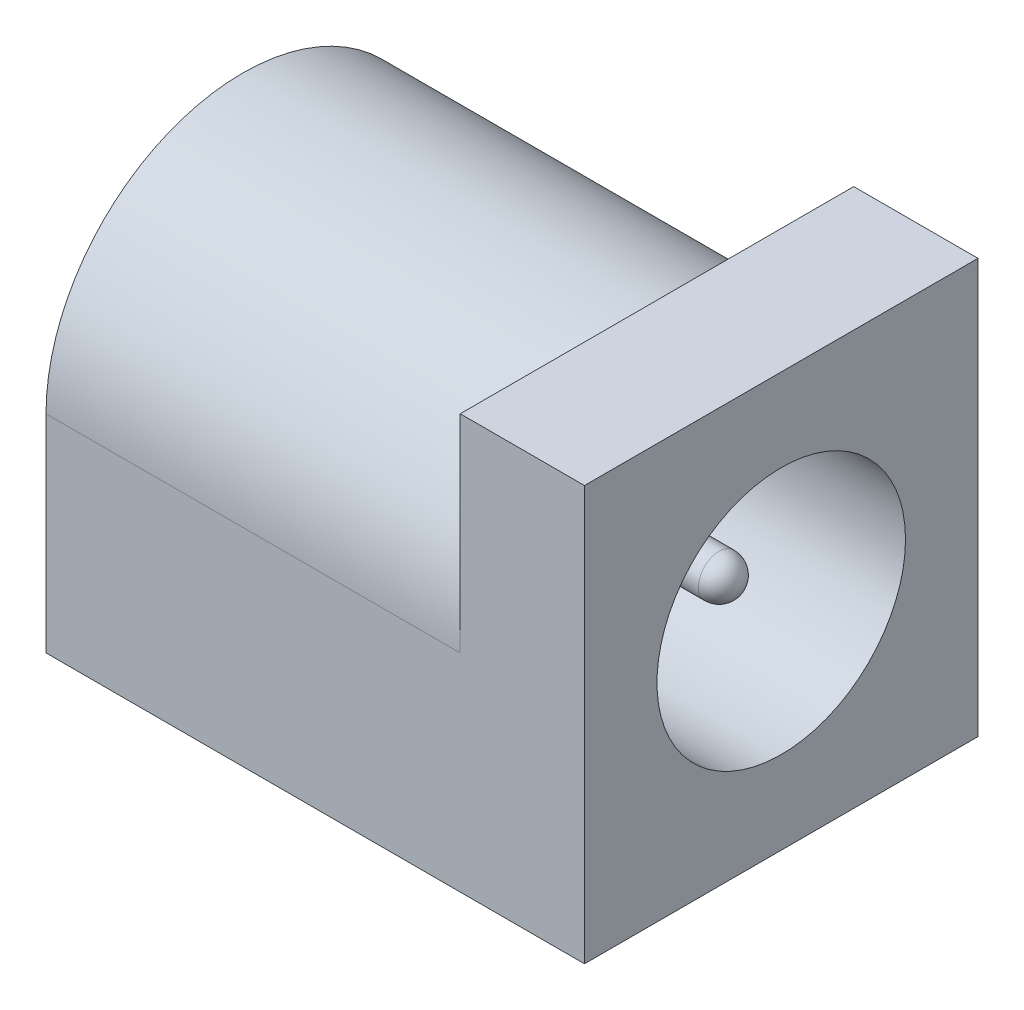
ISO-10303-21;
HEADER;
FILE_DESCRIPTION(('STEP AP214'),'2;1');
FILE_NAME('part.step','',(''),(''),'','','');
FILE_SCHEMA(('AUTOMOTIVE_DESIGN { 1 0 10303 214 1 1 1 1 }'));
ENDSEC;
DATA;
#1=APPLICATION_CONTEXT('core data for automotive mechanical design processes');
#2=APPLICATION_PROTOCOL_DEFINITION('international standard','automotive_design',2000,#1);
#3=PRODUCT_CONTEXT('',#1,'mechanical');
#4=PRODUCT('Part','Part','',(#3));
#5=PRODUCT_RELATED_PRODUCT_CATEGORY('part','',(#4));
#6=PRODUCT_DEFINITION_FORMATION('','',#4);
#7=PRODUCT_DEFINITION_CONTEXT('part definition',#1,'design');
#8=PRODUCT_DEFINITION('design','',#6,#7);
#9=PRODUCT_DEFINITION_SHAPE('','',#8);
#10=(LENGTH_UNIT() NAMED_UNIT(*) SI_UNIT(.MILLI.,.METRE.));
#11=(NAMED_UNIT(*) PLANE_ANGLE_UNIT() SI_UNIT($,.RADIAN.));
#12=(NAMED_UNIT(*) SI_UNIT($,.STERADIAN.) SOLID_ANGLE_UNIT());
#13=UNCERTAINTY_MEASURE_WITH_UNIT(LENGTH_MEASURE(1.E-05),#10,'distance_accuracy_value','');
#14=(GEOMETRIC_REPRESENTATION_CONTEXT(3) GLOBAL_UNCERTAINTY_ASSIGNED_CONTEXT((#13)) GLOBAL_UNIT_ASSIGNED_CONTEXT((#10,
#11,#12)) REPRESENTATION_CONTEXT('',''));
#15=CARTESIAN_POINT('',(0.,0.,0.));
#16=DIRECTION('',(0.,0.,1.));
#17=DIRECTION('',(1.,0.,0.));
#18=AXIS2_PLACEMENT_3D('',#15,#16,#17);
#19=CARTESIAN_POINT('',(10.,2.5,0.));
#20=DIRECTION('',(-1.,0.,0.));
#21=DIRECTION('',(0.,0.,1.));
#22=AXIS2_PLACEMENT_3D('',#19,#20,#21);
#23=CYLINDRICAL_SURFACE('',#22,4.75);
#24=CARTESIAN_POINT('',(0.,2.5,0.));
#25=DIRECTION('',(1.,0.,0.));
#26=DIRECTION('',(0.,0.,1.));
#27=AXIS2_PLACEMENT_3D('',#24,#25,#26);
#28=CIRCLE('',#27,4.75);
#29=CARTESIAN_POINT('',(0.,2.5,-4.75));
#30=VERTEX_POINT('',#29);
#31=CARTESIAN_POINT('',(0.,2.5,4.75));
#32=VERTEX_POINT('',#31);
#33=EDGE_CURVE('E93',#30,#32,#28,.T.);
#34=ORIENTED_EDGE('',*,*,#33,.T.);
#35=DIRECTION('',(-1.,0.,0.));
#36=VECTOR('',#35,1.);
#37=CARTESIAN_POINT('',(10.,2.5,4.75));
#38=LINE('',#37,#36);
#39=CARTESIAN_POINT('',(10.,2.5,4.75));
#40=VERTEX_POINT('',#39);
#41=EDGE_CURVE('E46',#40,#32,#38,.T.);
#42=ORIENTED_EDGE('',*,*,#41,.F.);
#43=CARTESIAN_POINT('',(10.,2.5,0.));
#44=DIRECTION('',(1.,0.,0.));
#45=DIRECTION('',(0.,0.,1.));
#46=AXIS2_PLACEMENT_3D('',#43,#44,#45);
#47=CIRCLE('',#46,4.75);
#48=CARTESIAN_POINT('',(10.,2.5,-4.75));
#49=VERTEX_POINT('',#48);
#50=EDGE_CURVE('E94',#49,#40,#47,.T.);
#51=ORIENTED_EDGE('',*,*,#50,.F.);
#52=DIRECTION('',(-1.,0.,0.));
#53=VECTOR('',#52,1.);
#54=CARTESIAN_POINT('',(10.,2.5,-4.75));
#55=LINE('',#54,#53);
#56=EDGE_CURVE('E53',#49,#30,#55,.T.);
#57=ORIENTED_EDGE('',*,*,#56,.T.);
#58=EDGE_LOOP('',(#34,#42,#51,#57));
#59=FACE_BOUND('',#58,.T.);
#60=ADVANCED_FACE('F37',(#59),#23,.T.);
#61=CARTESIAN_POINT('',(10.,-2.5,4.75));
#62=DIRECTION('',(0.,0.,-1.));
#63=DIRECTION('',(-1.,0.,0.));
#64=AXIS2_PLACEMENT_3D('',#61,#62,#63);
#65=PLANE('',#64);
#66=DIRECTION('',(0.,-1.,0.));
#67=VECTOR('',#66,1.);
#68=CARTESIAN_POINT('',(0.,-2.5,4.75));
#69=LINE('',#68,#67);
#70=CARTESIAN_POINT('',(0.,-2.5,4.75));
#71=VERTEX_POINT('',#70);
#72=EDGE_CURVE('E82',#32,#71,#69,.T.);
#73=ORIENTED_EDGE('',*,*,#72,.T.);
#74=DIRECTION('',(-1.,0.,0.));
#75=VECTOR('',#74,1.);
#76=CARTESIAN_POINT('',(10.,-2.5,4.75));
#77=LINE('',#76,#75);
#78=CARTESIAN_POINT('',(13.,-2.5,4.75));
#79=VERTEX_POINT('',#78);
#80=EDGE_CURVE('E78',#79,#71,#77,.T.);
#81=ORIENTED_EDGE('',*,*,#80,.F.);
#82=DIRECTION('',(0.,-1.,0.));
#83=VECTOR('',#82,1.);
#84=CARTESIAN_POINT('',(13.,7.5,4.75));
#85=LINE('',#84,#83);
#86=CARTESIAN_POINT('',(13.,7.5,4.75));
#87=VERTEX_POINT('',#86);
#88=EDGE_CURVE('E121',#87,#79,#85,.T.);
#89=ORIENTED_EDGE('',*,*,#88,.F.);
#90=DIRECTION('',(-1.,0.,0.));
#91=VECTOR('',#90,1.);
#92=CARTESIAN_POINT('',(13.,7.5,4.75));
#93=LINE('',#92,#91);
#94=CARTESIAN_POINT('',(10.,7.5,4.75));
#95=VERTEX_POINT('',#94);
#96=EDGE_CURVE('E113',#87,#95,#93,.T.);
#97=ORIENTED_EDGE('',*,*,#96,.T.);
#98=DIRECTION('',(0.,-1.,0.));
#99=VECTOR('',#98,1.);
#100=CARTESIAN_POINT('',(10.,7.5,4.75));
#101=LINE('',#100,#99);
#102=EDGE_CURVE('E108',#95,#40,#101,.T.);
#103=ORIENTED_EDGE('',*,*,#102,.T.);
#104=ORIENTED_EDGE('',*,*,#41,.T.);
#105=EDGE_LOOP('',(#73,#81,#89,#97,#103,#104));
#106=FACE_BOUND('',#105,.T.);
#107=ADVANCED_FACE('F105',(#106),#65,.F.);
#108=CARTESIAN_POINT('',(10.,-2.5,4.75));
#109=DIRECTION('',(0.,1.,0.));
#110=DIRECTION('',(0.,0.,1.));
#111=AXIS2_PLACEMENT_3D('',#108,#109,#110);
#112=PLANE('',#111);
#113=DIRECTION('',(0.,0.,-1.));
#114=VECTOR('',#113,1.);
#115=CARTESIAN_POINT('',(0.,-2.5,4.75));
#116=LINE('',#115,#114);
#117=CARTESIAN_POINT('',(0.,-2.5,-4.75));
#118=VERTEX_POINT('',#117);
#119=EDGE_CURVE('E70',#71,#118,#116,.T.);
#120=ORIENTED_EDGE('',*,*,#119,.T.);
#121=DIRECTION('',(-1.,0.,0.));
#122=VECTOR('',#121,1.);
#123=CARTESIAN_POINT('',(10.,-2.5,-4.75));
#124=LINE('',#123,#122);
#125=CARTESIAN_POINT('',(13.,-2.5,-4.75));
#126=VERTEX_POINT('',#125);
#127=EDGE_CURVE('E75',#126,#118,#124,.T.);
#128=ORIENTED_EDGE('',*,*,#127,.F.);
#129=DIRECTION('',(0.,0.,-1.));
#130=VECTOR('',#129,1.);
#131=CARTESIAN_POINT('',(13.,-2.5,4.75));
#132=LINE('',#131,#130);
#133=EDGE_CURVE('E129',#79,#126,#132,.T.);
#134=ORIENTED_EDGE('',*,*,#133,.F.);
#135=ORIENTED_EDGE('',*,*,#80,.T.);
#136=EDGE_LOOP('',(#120,#128,#134,#135));
#137=FACE_BOUND('',#136,.T.);
#138=ADVANCED_FACE('F72',(#137),#112,.F.);
#139=CARTESIAN_POINT('',(10.,-2.5,-4.75));
#140=DIRECTION('',(0.,0.,1.));
#141=DIRECTION('',(1.,0.,0.));
#142=AXIS2_PLACEMENT_3D('',#139,#140,#141);
#143=PLANE('',#142);
#144=DIRECTION('',(0.,1.,0.));
#145=VECTOR('',#144,1.);
#146=CARTESIAN_POINT('',(0.,-2.5,-4.75));
#147=LINE('',#146,#145);
#148=EDGE_CURVE('E81',#118,#30,#147,.T.);
#149=ORIENTED_EDGE('',*,*,#148,.T.);
#150=ORIENTED_EDGE('',*,*,#56,.F.);
#151=DIRECTION('',(0.,1.,0.));
#152=VECTOR('',#151,1.);
#153=CARTESIAN_POINT('',(10.,7.5,-4.75));
#154=LINE('',#153,#152);
#155=CARTESIAN_POINT('',(10.,7.5,-4.75));
#156=VERTEX_POINT('',#155);
#157=EDGE_CURVE('E122',#49,#156,#154,.T.);
#158=ORIENTED_EDGE('',*,*,#157,.T.);
#159=DIRECTION('',(-1.,0.,0.));
#160=VECTOR('',#159,1.);
#161=CARTESIAN_POINT('',(13.,7.5,-4.75));
#162=LINE('',#161,#160);
#163=CARTESIAN_POINT('',(13.,7.5,-4.75));
#164=VERTEX_POINT('',#163);
#165=EDGE_CURVE('E110',#164,#156,#162,.T.);
#166=ORIENTED_EDGE('',*,*,#165,.F.);
#167=DIRECTION('',(0.,1.,0.));
#168=VECTOR('',#167,1.);
#169=CARTESIAN_POINT('',(13.,7.5,-4.75));
#170=LINE('',#169,#168);
#171=EDGE_CURVE('E88',#126,#164,#170,.T.);
#172=ORIENTED_EDGE('',*,*,#171,.F.);
#173=ORIENTED_EDGE('',*,*,#127,.T.);
#174=EDGE_LOOP('',(#149,#150,#158,#166,#172,#173));
#175=FACE_BOUND('',#174,.T.);
#176=ADVANCED_FACE('F85',(#175),#143,.F.);
#177=CARTESIAN_POINT('',(0.,2.5,0.));
#178=DIRECTION('',(-1.,0.,0.));
#179=DIRECTION('',(0.,0.,1.));
#180=AXIS2_PLACEMENT_3D('',#177,#178,#179);
#181=PLANE('',#180);
#182=ORIENTED_EDGE('',*,*,#33,.F.);
#183=ORIENTED_EDGE('',*,*,#148,.F.);
#184=ORIENTED_EDGE('',*,*,#119,.F.);
#185=ORIENTED_EDGE('',*,*,#72,.F.);
#186=EDGE_LOOP('',(#182,#183,#184,#185));
#187=FACE_BOUND('',#186,.T.);
#188=ADVANCED_FACE('F91',(#187),#181,.T.);
#189=CARTESIAN_POINT('',(13.,7.5,4.75));
#190=DIRECTION('',(0.,-1.,0.));
#191=DIRECTION('',(0.,0.,-1.));
#192=AXIS2_PLACEMENT_3D('',#189,#190,#191);
#193=PLANE('',#192);
#194=DIRECTION('',(0.,0.,1.));
#195=VECTOR('',#194,1.);
#196=CARTESIAN_POINT('',(10.,7.5,4.75));
#197=LINE('',#196,#195);
#198=EDGE_CURVE('E118',#156,#95,#197,.T.);
#199=ORIENTED_EDGE('',*,*,#198,.T.);
#200=ORIENTED_EDGE('',*,*,#96,.F.);
#201=DIRECTION('',(0.,0.,1.));
#202=VECTOR('',#201,1.);
#203=CARTESIAN_POINT('',(13.,7.5,4.75));
#204=LINE('',#203,#202);
#205=EDGE_CURVE('E117',#164,#87,#204,.T.);
#206=ORIENTED_EDGE('',*,*,#205,.F.);
#207=ORIENTED_EDGE('',*,*,#165,.T.);
#208=EDGE_LOOP('',(#199,#200,#206,#207));
#209=FACE_BOUND('',#208,.T.);
#210=ADVANCED_FACE('F160',(#209),#193,.F.);
#211=CARTESIAN_POINT('',(13.,0.,0.));
#212=DIRECTION('',(1.,0.,0.));
#213=DIRECTION('',(0.,0.,-1.));
#214=AXIS2_PLACEMENT_3D('',#211,#212,#213);
#215=PLANE('',#214);
#216=CARTESIAN_POINT('',(13.,2.5,0.));
#217=DIRECTION('',(1.,0.,0.));
#218=DIRECTION('',(0.,0.,-1.));
#219=AXIS2_PLACEMENT_3D('',#216,#217,#218);
#220=CIRCLE('',#219,3.);
#221=CARTESIAN_POINT('',(13.,2.5,-3.));
#222=VERTEX_POINT('',#221);
#223=EDGE_CURVE('E133',#222,#222,#220,.T.);
#224=ORIENTED_EDGE('',*,*,#223,.F.);
#225=EDGE_LOOP('',(#224));
#226=FACE_BOUND('',#225,.T.);
#227=ORIENTED_EDGE('',*,*,#88,.T.);
#228=ORIENTED_EDGE('',*,*,#133,.T.);
#229=ORIENTED_EDGE('',*,*,#171,.T.);
#230=ORIENTED_EDGE('',*,*,#205,.T.);
#231=EDGE_LOOP('',(#227,#228,#229,#230));
#232=FACE_BOUND('',#231,.T.);
#233=ADVANCED_FACE('F157',(#226,#232),#215,.T.);
#234=CARTESIAN_POINT('',(10.,0.,0.));
#235=DIRECTION('',(1.,0.,0.));
#236=DIRECTION('',(0.,0.,-1.));
#237=AXIS2_PLACEMENT_3D('',#234,#235,#236);
#238=PLANE('',#237);
#239=ORIENTED_EDGE('',*,*,#157,.F.);
#240=ORIENTED_EDGE('',*,*,#50,.T.);
#241=ORIENTED_EDGE('',*,*,#102,.F.);
#242=ORIENTED_EDGE('',*,*,#198,.F.);
#243=EDGE_LOOP('',(#239,#240,#241,#242));
#244=FACE_BOUND('',#243,.T.);
#245=ADVANCED_FACE('F153',(#244),#238,.F.);
#246=CARTESIAN_POINT('',(1.,2.5,0.));
#247=DIRECTION('',(1.,0.,0.));
#248=DIRECTION('',(0.,0.,-1.));
#249=AXIS2_PLACEMENT_3D('',#246,#247,#248);
#250=CYLINDRICAL_SURFACE('',#249,3.);
#251=CARTESIAN_POINT('',(1.,2.5,0.));
#252=DIRECTION('',(1.,0.,0.));
#253=DIRECTION('',(0.,0.,-1.));
#254=AXIS2_PLACEMENT_3D('',#251,#252,#253);
#255=CIRCLE('',#254,3.);
#256=CARTESIAN_POINT('',(1.,2.5,-3.));
#257=VERTEX_POINT('',#256);
#258=EDGE_CURVE('E125',#257,#257,#255,.T.);
#259=ORIENTED_EDGE('',*,*,#258,.F.);
#260=EDGE_LOOP('',(#259));
#261=FACE_BOUND('',#260,.T.);
#262=ORIENTED_EDGE('',*,*,#223,.T.);
#263=EDGE_LOOP('',(#262));
#264=FACE_BOUND('',#263,.T.);
#265=ADVANCED_FACE('F147',(#261,#264),#250,.F.);
#266=CARTESIAN_POINT('',(1.,2.5,0.));
#267=DIRECTION('',(1.,0.,0.));
#268=DIRECTION('',(0.,0.,-1.));
#269=AXIS2_PLACEMENT_3D('',#266,#267,#268);
#270=PLANE('',#269);
#271=CARTESIAN_POINT('',(1.,2.5,0.));
#272=DIRECTION('',(1.,0.,0.));
#273=DIRECTION('',(0.,0.,-1.));
#274=AXIS2_PLACEMENT_3D('',#271,#272,#273);
#275=CIRCLE('',#274,0.5);
#276=CARTESIAN_POINT('',(1.,2.5,-0.500000000000001));
#277=VERTEX_POINT('',#276);
#278=EDGE_CURVE('E136',#277,#277,#275,.T.);
#279=ORIENTED_EDGE('',*,*,#278,.F.);
#280=EDGE_LOOP('',(#279));
#281=FACE_BOUND('',#280,.T.);
#282=ORIENTED_EDGE('',*,*,#258,.T.);
#283=EDGE_LOOP('',(#282));
#284=FACE_BOUND('',#283,.T.);
#285=ADVANCED_FACE('F144',(#281,#284),#270,.T.);
#286=CARTESIAN_POINT('',(12.,2.5,0.));
#287=DIRECTION('',(-1.,0.,0.));
#288=DIRECTION('',(0.,0.,1.));
#289=AXIS2_PLACEMENT_3D('',#286,#287,#288);
#290=CYLINDRICAL_SURFACE('',#289,0.5);
#291=CARTESIAN_POINT('',(11.5,2.5,0.));
#292=DIRECTION('',(-1.,0.,0.));
#293=DIRECTION('',(0.,0.,1.));
#294=AXIS2_PLACEMENT_3D('',#291,#292,#293);
#295=CIRCLE('',#294,0.5);
#296=CARTESIAN_POINT('',(11.5,2.5,0.499999999999999));
#297=VERTEX_POINT('',#296);
#298=EDGE_CURVE('E11',#297,#297,#295,.T.);
#299=ORIENTED_EDGE('',*,*,#298,.T.);
#300=EDGE_LOOP('',(#299));
#301=FACE_BOUND('',#300,.T.);
#302=ORIENTED_EDGE('',*,*,#278,.T.);
#303=EDGE_LOOP('',(#302));
#304=FACE_BOUND('',#303,.T.);
#305=ADVANCED_FACE('F142',(#301,#304),#290,.T.);
#306=CARTESIAN_POINT('',(11.5,2.5,0.));
#307=DIRECTION('',(1.,0.,0.));
#308=DIRECTION('',(0.,0.,-1.));
#309=AXIS2_PLACEMENT_3D('',#306,#307,#308);
#310=SPHERICAL_SURFACE('',#309,0.5);
#311=ORIENTED_EDGE('',*,*,#298,.F.);
#312=EDGE_LOOP('',(#311));
#313=FACE_BOUND('',#312,.T.);
#314=ADVANCED_FACE('F39',(#313),#310,.T.);
#315=CLOSED_SHELL('',(#60,#107,#138,#176,#188,#210,#233,#245,#265,#285,#305,#314));
#316=MANIFOLD_SOLID_BREP('B2',#315);
#317=ADVANCED_BREP_SHAPE_REPRESENTATION('',(#18,#316),#14);
#318=SHAPE_DEFINITION_REPRESENTATION(#9,#317);
ENDSEC;
END-ISO-10303-21;
